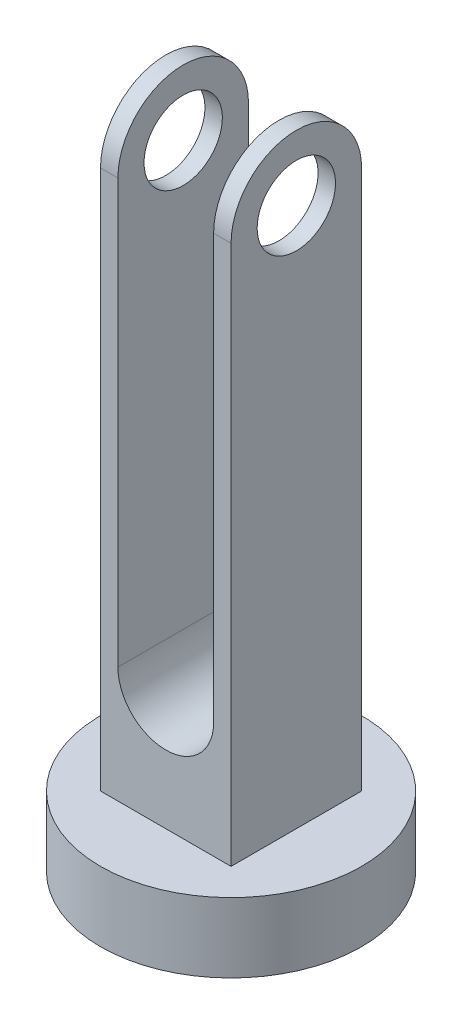
ISO-10303-21;
HEADER;
FILE_DESCRIPTION(('STEP AP214'),'2;1');
FILE_NAME('part.step','',(''),(''),'','','');
FILE_SCHEMA(('AUTOMOTIVE_DESIGN { 1 0 10303 214 1 1 1 1 }'));
ENDSEC;
DATA;
#1=APPLICATION_CONTEXT('core data for automotive mechanical design processes');
#2=APPLICATION_PROTOCOL_DEFINITION('international standard','automotive_design',2000,#1);
#3=PRODUCT_CONTEXT('',#1,'mechanical');
#4=PRODUCT('Part','Part','',(#3));
#5=PRODUCT_RELATED_PRODUCT_CATEGORY('part','',(#4));
#6=PRODUCT_DEFINITION_FORMATION('','',#4);
#7=PRODUCT_DEFINITION_CONTEXT('part definition',#1,'design');
#8=PRODUCT_DEFINITION('design','',#6,#7);
#9=PRODUCT_DEFINITION_SHAPE('','',#8);
#10=(LENGTH_UNIT() NAMED_UNIT(*) SI_UNIT(.MILLI.,.METRE.));
#11=(NAMED_UNIT(*) PLANE_ANGLE_UNIT() SI_UNIT($,.RADIAN.));
#12=(NAMED_UNIT(*) SI_UNIT($,.STERADIAN.) SOLID_ANGLE_UNIT());
#13=UNCERTAINTY_MEASURE_WITH_UNIT(LENGTH_MEASURE(1.E-05),#10,'distance_accuracy_value','');
#14=(GEOMETRIC_REPRESENTATION_CONTEXT(3) GLOBAL_UNCERTAINTY_ASSIGNED_CONTEXT((#13)) GLOBAL_UNIT_ASSIGNED_CONTEXT((#10,
#11,#12)) REPRESENTATION_CONTEXT('',''));
#15=CARTESIAN_POINT('',(0.,0.,0.));
#16=DIRECTION('',(0.,0.,1.));
#17=DIRECTION('',(1.,0.,0.));
#18=AXIS2_PLACEMENT_3D('',#15,#16,#17);
#19=CARTESIAN_POINT('',(42.4999999999999,350.,0.));
#20=DIRECTION('',(-1.,0.,0.));
#21=DIRECTION('',(0.,0.,1.));
#22=AXIS2_PLACEMENT_3D('',#19,#20,#21);
#23=CYLINDRICAL_SURFACE('',#22,37.5);
#24=CARTESIAN_POINT('',(27.5,350.,0.));
#25=DIRECTION('',(1.,0.,0.));
#26=DIRECTION('',(0.,1.,0.));
#27=AXIS2_PLACEMENT_3D('',#24,#25,#26);
#28=CIRCLE('',#27,37.5);
#29=CARTESIAN_POINT('',(27.5,350.,37.5));
#30=VERTEX_POINT('',#29);
#31=CARTESIAN_POINT('',(27.5,350.,-37.5));
#32=VERTEX_POINT('',#31);
#33=EDGE_CURVE('E161',#30,#32,#28,.F.);
#34=ORIENTED_EDGE('',*,*,#33,.F.);
#35=DIRECTION('',(-1.,0.,0.));
#36=VECTOR('',#35,1.);
#37=CARTESIAN_POINT('',(42.4999999999999,350.,37.5));
#38=LINE('',#37,#36);
#39=CARTESIAN_POINT('',(37.5,350.,37.5));
#40=VERTEX_POINT('',#39);
#41=EDGE_CURVE('E183',#40,#30,#38,.T.);
#42=ORIENTED_EDGE('',*,*,#41,.F.);
#43=CARTESIAN_POINT('',(37.5,350.,0.));
#44=DIRECTION('',(-1.,0.,0.));
#45=DIRECTION('',(0.,0.,1.));
#46=AXIS2_PLACEMENT_3D('',#43,#44,#45);
#47=CIRCLE('',#46,37.5);
#48=CARTESIAN_POINT('',(37.5,350.,-37.5));
#49=VERTEX_POINT('',#48);
#50=EDGE_CURVE('E186',#40,#49,#47,.T.);
#51=ORIENTED_EDGE('',*,*,#50,.T.);
#52=DIRECTION('',(-1.,0.,0.));
#53=VECTOR('',#52,1.);
#54=CARTESIAN_POINT('',(42.4999999999999,350.,-37.5));
#55=LINE('',#54,#53);
#56=EDGE_CURVE('E12',#49,#32,#55,.T.);
#57=ORIENTED_EDGE('',*,*,#56,.T.);
#58=EDGE_LOOP('',(#34,#42,#51,#57));
#59=FACE_BOUND('',#58,.T.);
#60=ADVANCED_FACE('F57',(#59),#23,.T.);
#61=CARTESIAN_POINT('',(42.4999999999999,350.,0.));
#62=DIRECTION('',(-1.,0.,0.));
#63=DIRECTION('',(0.,0.,1.));
#64=AXIS2_PLACEMENT_3D('',#61,#62,#63);
#65=CYLINDRICAL_SURFACE('',#64,22.5);
#66=CARTESIAN_POINT('',(27.5,350.,0.));
#67=DIRECTION('',(1.,0.,0.));
#68=DIRECTION('',(0.,1.,0.));
#69=AXIS2_PLACEMENT_3D('',#66,#67,#68);
#70=CIRCLE('',#69,22.5);
#71=CARTESIAN_POINT('',(27.5,372.5,0.));
#72=VERTEX_POINT('',#71);
#73=EDGE_CURVE('E61',#72,#72,#70,.F.);
#74=ORIENTED_EDGE('',*,*,#73,.T.);
#75=EDGE_LOOP('',(#74));
#76=FACE_BOUND('',#75,.T.);
#77=CARTESIAN_POINT('',(37.5,350.,0.));
#78=DIRECTION('',(-1.,0.,0.));
#79=DIRECTION('',(0.,0.,1.));
#80=AXIS2_PLACEMENT_3D('',#77,#78,#79);
#81=CIRCLE('',#80,22.5);
#82=CARTESIAN_POINT('',(37.5,350.,22.5));
#83=VERTEX_POINT('',#82);
#84=EDGE_CURVE('E174',#83,#83,#81,.T.);
#85=ORIENTED_EDGE('',*,*,#84,.F.);
#86=EDGE_LOOP('',(#85));
#87=FACE_BOUND('',#86,.T.);
#88=ADVANCED_FACE('F239',(#76,#87),#65,.F.);
#89=CARTESIAN_POINT('',(37.5,387.5,37.5));
#90=DIRECTION('',(-1.,0.,0.));
#91=DIRECTION('',(0.,0.,1.));
#92=AXIS2_PLACEMENT_3D('',#89,#90,#91);
#93=PLANE('',#92);
#94=ORIENTED_EDGE('',*,*,#84,.T.);
#95=EDGE_LOOP('',(#94));
#96=FACE_BOUND('',#95,.T.);
#97=DIRECTION('',(0.,-1.,0.));
#98=VECTOR('',#97,1.);
#99=CARTESIAN_POINT('',(37.5,387.5,-37.5));
#100=LINE('',#99,#98);
#101=CARTESIAN_POINT('',(37.5,40.,-37.5));
#102=VERTEX_POINT('',#101);
#103=EDGE_CURVE('E212',#49,#102,#100,.T.);
#104=ORIENTED_EDGE('',*,*,#103,.F.);
#105=ORIENTED_EDGE('',*,*,#50,.F.);
#106=DIRECTION('',(0.,-1.,0.));
#107=VECTOR('',#106,1.);
#108=CARTESIAN_POINT('',(37.5,387.5,37.5));
#109=LINE('',#108,#107);
#110=CARTESIAN_POINT('',(37.5,40.,37.5));
#111=VERTEX_POINT('',#110);
#112=EDGE_CURVE('E83',#40,#111,#109,.T.);
#113=ORIENTED_EDGE('',*,*,#112,.T.);
#114=DIRECTION('',(0.,0.,-1.));
#115=VECTOR('',#114,1.);
#116=CARTESIAN_POINT('',(37.5,40.,37.5));
#117=LINE('',#116,#115);
#118=EDGE_CURVE('E189',#111,#102,#117,.T.);
#119=ORIENTED_EDGE('',*,*,#118,.T.);
#120=EDGE_LOOP('',(#104,#105,#113,#119));
#121=FACE_BOUND('',#120,.T.);
#122=ADVANCED_FACE('F246',(#96,#121),#93,.F.);
#123=CARTESIAN_POINT('',(-37.5,387.5,37.5));
#124=DIRECTION('',(1.,0.,0.));
#125=DIRECTION('',(0.,0.,-1.));
#126=AXIS2_PLACEMENT_3D('',#123,#124,#125);
#127=PLANE('',#126);
#128=CARTESIAN_POINT('',(-37.5,350.,0.));
#129=DIRECTION('',(-1.,0.,0.));
#130=DIRECTION('',(0.,0.,1.));
#131=AXIS2_PLACEMENT_3D('',#128,#129,#130);
#132=CIRCLE('',#131,22.5);
#133=CARTESIAN_POINT('',(-37.5,350.,22.5));
#134=VERTEX_POINT('',#133);
#135=EDGE_CURVE('E170',#134,#134,#132,.T.);
#136=ORIENTED_EDGE('',*,*,#135,.F.);
#137=EDGE_LOOP('',(#136));
#138=FACE_BOUND('',#137,.T.);
#139=CARTESIAN_POINT('',(-37.5,350.,0.));
#140=DIRECTION('',(-1.,0.,0.));
#141=DIRECTION('',(0.,0.,1.));
#142=AXIS2_PLACEMENT_3D('',#139,#140,#141);
#143=CIRCLE('',#142,37.5);
#144=CARTESIAN_POINT('',(-37.5,350.,37.5));
#145=VERTEX_POINT('',#144);
#146=CARTESIAN_POINT('',(-37.5,350.,-37.5));
#147=VERTEX_POINT('',#146);
#148=EDGE_CURVE('E178',#145,#147,#143,.T.);
#149=ORIENTED_EDGE('',*,*,#148,.T.);
#150=DIRECTION('',(0.,-1.,0.));
#151=VECTOR('',#150,1.);
#152=CARTESIAN_POINT('',(-37.5,387.5,-37.5));
#153=LINE('',#152,#151);
#154=CARTESIAN_POINT('',(-37.5,40.,-37.5));
#155=VERTEX_POINT('',#154);
#156=EDGE_CURVE('E209',#147,#155,#153,.T.);
#157=ORIENTED_EDGE('',*,*,#156,.T.);
#158=DIRECTION('',(0.,0.,1.));
#159=VECTOR('',#158,1.);
#160=CARTESIAN_POINT('',(-37.5,40.,37.5));
#161=LINE('',#160,#159);
#162=CARTESIAN_POINT('',(-37.5,40.,37.5));
#163=VERTEX_POINT('',#162);
#164=EDGE_CURVE('E196',#155,#163,#161,.T.);
#165=ORIENTED_EDGE('',*,*,#164,.T.);
#166=DIRECTION('',(0.,-1.,0.));
#167=VECTOR('',#166,1.);
#168=CARTESIAN_POINT('',(-37.5,387.5,37.5));
#169=LINE('',#168,#167);
#170=EDGE_CURVE('E206',#145,#163,#169,.T.);
#171=ORIENTED_EDGE('',*,*,#170,.F.);
#172=EDGE_LOOP('',(#149,#157,#165,#171));
#173=FACE_BOUND('',#172,.T.);
#174=ADVANCED_FACE('F280',(#138,#173),#127,.F.);
#175=CARTESIAN_POINT('',(-37.5,387.5,-37.5));
#176=DIRECTION('',(0.,0.,1.));
#177=DIRECTION('',(1.,0.,0.));
#178=AXIS2_PLACEMENT_3D('',#175,#176,#177);
#179=PLANE('',#178);
#180=CARTESIAN_POINT('',(0.,106.661183130818,-37.5));
#181=DIRECTION('',(0.,0.,1.));
#182=DIRECTION('',(1.,0.,0.));
#183=AXIS2_PLACEMENT_3D('',#180,#181,#182);
#184=CIRCLE('',#183,27.5);
#185=CARTESIAN_POINT('',(-27.5,106.661183130818,-37.5));
#186=VERTEX_POINT('',#185);
#187=CARTESIAN_POINT('',(27.5,106.661183130818,-37.5));
#188=VERTEX_POINT('',#187);
#189=EDGE_CURVE('E135',#186,#188,#184,.T.);
#190=ORIENTED_EDGE('',*,*,#189,.T.);
#191=DIRECTION('',(0.,1.,0.));
#192=VECTOR('',#191,1.);
#193=CARTESIAN_POINT('',(27.5,387.5,-37.5));
#194=LINE('',#193,#192);
#195=EDGE_CURVE('E164',#188,#32,#194,.T.);
#196=ORIENTED_EDGE('',*,*,#195,.T.);
#197=ORIENTED_EDGE('',*,*,#56,.F.);
#198=ORIENTED_EDGE('',*,*,#103,.T.);
#199=DIRECTION('',(-1.,0.,0.));
#200=VECTOR('',#199,1.);
#201=CARTESIAN_POINT('',(-37.5,40.,-37.5));
#202=LINE('',#201,#200);
#203=EDGE_CURVE('E192',#102,#155,#202,.T.);
#204=ORIENTED_EDGE('',*,*,#203,.T.);
#205=ORIENTED_EDGE('',*,*,#156,.F.);
#206=CARTESIAN_POINT('',(-27.5,350.,-37.5));
#207=VERTEX_POINT('',#206);
#208=EDGE_CURVE('E67',#207,#147,#55,.T.);
#209=ORIENTED_EDGE('',*,*,#208,.F.);
#210=DIRECTION('',(0.,-1.,0.));
#211=VECTOR('',#210,1.);
#212=CARTESIAN_POINT('',(-27.5,387.5,-37.5));
#213=LINE('',#212,#211);
#214=EDGE_CURVE('E75',#207,#186,#213,.T.);
#215=ORIENTED_EDGE('',*,*,#214,.T.);
#216=EDGE_LOOP('',(#190,#196,#197,#198,#204,#205,#209,#215));
#217=FACE_BOUND('',#216,.T.);
#218=ADVANCED_FACE('F262',(#217),#179,.F.);
#219=CARTESIAN_POINT('',(0.,40.,0.));
#220=DIRECTION('',(0.,-1.,0.));
#221=DIRECTION('',(0.,0.,-1.));
#222=AXIS2_PLACEMENT_3D('',#219,#220,#221);
#223=CYLINDRICAL_SURFACE('',#222,75.);
#224=CARTESIAN_POINT('',(0.,40.,0.));
#225=DIRECTION('',(0.,1.,0.));
#226=DIRECTION('',(0.,0.,1.));
#227=AXIS2_PLACEMENT_3D('',#224,#225,#226);
#228=CIRCLE('',#227,75.);
#229=CARTESIAN_POINT('',(0.,40.,75.));
#230=VERTEX_POINT('',#229);
#231=EDGE_CURVE('E216',#230,#230,#228,.T.);
#232=ORIENTED_EDGE('',*,*,#231,.F.);
#233=EDGE_LOOP('',(#232));
#234=FACE_BOUND('',#233,.T.);
#235=CARTESIAN_POINT('',(0.,0.,0.));
#236=DIRECTION('',(0.,1.,0.));
#237=DIRECTION('',(0.,0.,1.));
#238=AXIS2_PLACEMENT_3D('',#235,#236,#237);
#239=CIRCLE('',#238,75.);
#240=CARTESIAN_POINT('',(0.,0.,75.));
#241=VERTEX_POINT('',#240);
#242=EDGE_CURVE('E215',#241,#241,#239,.T.);
#243=ORIENTED_EDGE('',*,*,#242,.T.);
#244=EDGE_LOOP('',(#243));
#245=FACE_BOUND('',#244,.T.);
#246=ADVANCED_FACE('F59',(#234,#245),#223,.T.);
#247=CARTESIAN_POINT('',(0.,40.,0.));
#248=DIRECTION('',(0.,1.,0.));
#249=DIRECTION('',(0.,0.,1.));
#250=AXIS2_PLACEMENT_3D('',#247,#248,#249);
#251=PLANE('',#250);
#252=ORIENTED_EDGE('',*,*,#118,.F.);
#253=DIRECTION('',(1.,0.,0.));
#254=VECTOR('',#253,1.);
#255=CARTESIAN_POINT('',(-37.5,40.,37.5));
#256=LINE('',#255,#254);
#257=EDGE_CURVE('E200',#163,#111,#256,.T.);
#258=ORIENTED_EDGE('',*,*,#257,.F.);
#259=ORIENTED_EDGE('',*,*,#164,.F.);
#260=ORIENTED_EDGE('',*,*,#203,.F.);
#261=EDGE_LOOP('',(#252,#258,#259,#260));
#262=FACE_BOUND('',#261,.T.);
#263=ORIENTED_EDGE('',*,*,#231,.T.);
#264=EDGE_LOOP('',(#263));
#265=FACE_BOUND('',#264,.T.);
#266=ADVANCED_FACE('F276',(#262,#265),#251,.T.);
#267=CARTESIAN_POINT('',(0.,0.,0.));
#268=DIRECTION('',(0.,1.,0.));
#269=DIRECTION('',(0.,0.,1.));
#270=AXIS2_PLACEMENT_3D('',#267,#268,#269);
#271=PLANE('',#270);
#272=ORIENTED_EDGE('',*,*,#242,.F.);
#273=EDGE_LOOP('',(#272));
#274=FACE_BOUND('',#273,.T.);
#275=ADVANCED_FACE('F257',(#274),#271,.F.);
#276=CARTESIAN_POINT('',(-37.5,387.5,37.5));
#277=DIRECTION('',(0.,0.,-1.));
#278=DIRECTION('',(-1.,0.,0.));
#279=AXIS2_PLACEMENT_3D('',#276,#277,#278);
#280=PLANE('',#279);
#281=ORIENTED_EDGE('',*,*,#41,.T.);
#282=DIRECTION('',(0.,1.,0.));
#283=VECTOR('',#282,1.);
#284=CARTESIAN_POINT('',(27.5,401.577624337562,37.5));
#285=LINE('',#284,#283);
#286=CARTESIAN_POINT('',(27.5,106.661183130818,37.5));
#287=VERTEX_POINT('',#286);
#288=EDGE_CURVE('E146',#287,#30,#285,.T.);
#289=ORIENTED_EDGE('',*,*,#288,.F.);
#290=CARTESIAN_POINT('',(0.,106.661183130818,37.5));
#291=DIRECTION('',(0.,0.,1.));
#292=DIRECTION('',(1.,0.,0.));
#293=AXIS2_PLACEMENT_3D('',#290,#291,#292);
#294=CIRCLE('',#293,27.5);
#295=CARTESIAN_POINT('',(-27.5,106.661183130818,37.5));
#296=VERTEX_POINT('',#295);
#297=EDGE_CURVE('E132',#296,#287,#294,.T.);
#298=ORIENTED_EDGE('',*,*,#297,.F.);
#299=DIRECTION('',(0.,-1.,0.));
#300=VECTOR('',#299,1.);
#301=CARTESIAN_POINT('',(-27.5,401.577624337562,37.5));
#302=LINE('',#301,#300);
#303=CARTESIAN_POINT('',(-27.5,350.,37.5));
#304=VERTEX_POINT('',#303);
#305=EDGE_CURVE('E140',#304,#296,#302,.T.);
#306=ORIENTED_EDGE('',*,*,#305,.F.);
#307=EDGE_CURVE('E182',#304,#145,#38,.T.);
#308=ORIENTED_EDGE('',*,*,#307,.T.);
#309=ORIENTED_EDGE('',*,*,#170,.T.);
#310=ORIENTED_EDGE('',*,*,#257,.T.);
#311=ORIENTED_EDGE('',*,*,#112,.F.);
#312=EDGE_LOOP('',(#281,#289,#298,#306,#308,#309,#310,#311));
#313=FACE_BOUND('',#312,.T.);
#314=ADVANCED_FACE('F149',(#313),#280,.F.);
#315=CARTESIAN_POINT('',(-27.5,350.,0.));
#316=DIRECTION('',(-1.,0.,0.));
#317=DIRECTION('',(0.,-1.,0.));
#318=AXIS2_PLACEMENT_3D('',#315,#316,#317);
#319=CIRCLE('',#318,37.5);
#320=EDGE_CURVE('E142',#207,#304,#319,.F.);
#321=ORIENTED_EDGE('',*,*,#320,.F.);
#322=ORIENTED_EDGE('',*,*,#208,.T.);
#323=ORIENTED_EDGE('',*,*,#148,.F.);
#324=ORIENTED_EDGE('',*,*,#307,.F.);
#325=EDGE_LOOP('',(#321,#322,#323,#324));
#326=FACE_BOUND('',#325,.T.);
#327=ADVANCED_FACE('F242',(#326),#23,.T.);
#328=CARTESIAN_POINT('',(-27.5,350.,0.));
#329=DIRECTION('',(-1.,0.,0.));
#330=DIRECTION('',(0.,-1.,0.));
#331=AXIS2_PLACEMENT_3D('',#328,#329,#330);
#332=CIRCLE('',#331,22.5);
#333=CARTESIAN_POINT('',(-27.5,327.5,0.));
#334=VERTEX_POINT('',#333);
#335=EDGE_CURVE('E155',#334,#334,#332,.F.);
#336=ORIENTED_EDGE('',*,*,#335,.T.);
#337=EDGE_LOOP('',(#336));
#338=FACE_BOUND('',#337,.T.);
#339=ORIENTED_EDGE('',*,*,#135,.T.);
#340=EDGE_LOOP('',(#339));
#341=FACE_BOUND('',#340,.T.);
#342=ADVANCED_FACE('F226',(#338,#341),#65,.F.);
#343=CARTESIAN_POINT('',(0.,106.661183130818,-42.4999999999999));
#344=DIRECTION('',(0.,0.,1.));
#345=DIRECTION('',(1.,0.,0.));
#346=AXIS2_PLACEMENT_3D('',#343,#344,#345);
#347=CYLINDRICAL_SURFACE('',#346,27.5);
#348=DIRECTION('',(0.,0.,1.));
#349=VECTOR('',#348,1.);
#350=CARTESIAN_POINT('',(-27.5,106.661183130818,-42.4999999999999));
#351=LINE('',#350,#349);
#352=EDGE_CURVE('E127',#186,#296,#351,.T.);
#353=ORIENTED_EDGE('',*,*,#352,.T.);
#354=ORIENTED_EDGE('',*,*,#297,.T.);
#355=DIRECTION('',(0.,0.,1.));
#356=VECTOR('',#355,1.);
#357=CARTESIAN_POINT('',(27.5,106.661183130818,-42.4999999999999));
#358=LINE('',#357,#356);
#359=EDGE_CURVE('E137',#188,#287,#358,.T.);
#360=ORIENTED_EDGE('',*,*,#359,.F.);
#361=ORIENTED_EDGE('',*,*,#189,.F.);
#362=EDGE_LOOP('',(#353,#354,#360,#361));
#363=FACE_BOUND('',#362,.T.);
#364=ADVANCED_FACE('F129',(#363),#347,.F.);
#365=CARTESIAN_POINT('',(27.5,401.577624337562,-42.4999999999999));
#366=DIRECTION('',(1.,0.,0.));
#367=DIRECTION('',(0.,1.,0.));
#368=AXIS2_PLACEMENT_3D('',#365,#366,#367);
#369=PLANE('',#368);
#370=ORIENTED_EDGE('',*,*,#73,.F.);
#371=EDGE_LOOP('',(#370));
#372=FACE_BOUND('',#371,.T.);
#373=ORIENTED_EDGE('',*,*,#359,.T.);
#374=ORIENTED_EDGE('',*,*,#288,.T.);
#375=ORIENTED_EDGE('',*,*,#33,.T.);
#376=ORIENTED_EDGE('',*,*,#195,.F.);
#377=EDGE_LOOP('',(#373,#374,#375,#376));
#378=FACE_BOUND('',#377,.T.);
#379=ADVANCED_FACE('F230',(#372,#378),#369,.F.);
#380=CARTESIAN_POINT('',(-27.5,401.577624337562,-42.4999999999999));
#381=DIRECTION('',(-1.,0.,0.));
#382=DIRECTION('',(0.,-1.,0.));
#383=AXIS2_PLACEMENT_3D('',#380,#381,#382);
#384=PLANE('',#383);
#385=ORIENTED_EDGE('',*,*,#335,.F.);
#386=EDGE_LOOP('',(#385));
#387=FACE_BOUND('',#386,.T.);
#388=ORIENTED_EDGE('',*,*,#320,.T.);
#389=ORIENTED_EDGE('',*,*,#305,.T.);
#390=ORIENTED_EDGE('',*,*,#352,.F.);
#391=ORIENTED_EDGE('',*,*,#214,.F.);
#392=EDGE_LOOP('',(#388,#389,#390,#391));
#393=FACE_BOUND('',#392,.T.);
#394=ADVANCED_FACE('F141',(#387,#393),#384,.F.);
#395=CLOSED_SHELL('',(#60,#88,#122,#174,#218,#246,#266,#275,#314,#327,#342,#364,#379,#394));
#396=MANIFOLD_SOLID_BREP('B2',#395);
#397=ADVANCED_BREP_SHAPE_REPRESENTATION('',(#18,#396),#14);
#398=SHAPE_DEFINITION_REPRESENTATION(#9,#397);
ENDSEC;
END-ISO-10303-21;
